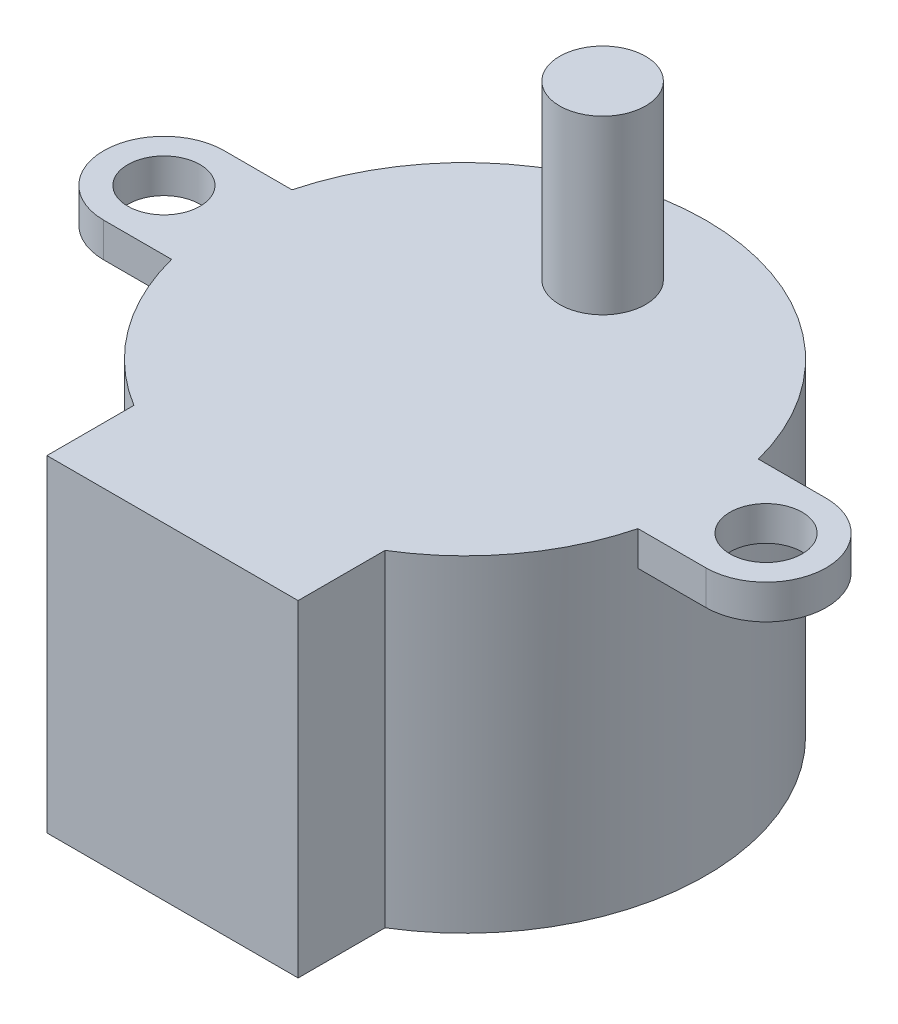
ISO-10303-21;
HEADER;
FILE_DESCRIPTION(('STEP AP214'),'2;1');
FILE_NAME('part.step','',(''),(''),'','','');
FILE_SCHEMA(('AUTOMOTIVE_DESIGN { 1 0 10303 214 1 1 1 1 }'));
ENDSEC;
DATA;
#1=APPLICATION_CONTEXT('core data for automotive mechanical design processes');
#2=APPLICATION_PROTOCOL_DEFINITION('international standard','automotive_design',2000,#1);
#3=PRODUCT_CONTEXT('',#1,'mechanical');
#4=PRODUCT('Part','Part','',(#3));
#5=PRODUCT_RELATED_PRODUCT_CATEGORY('part','',(#4));
#6=PRODUCT_DEFINITION_FORMATION('','',#4);
#7=PRODUCT_DEFINITION_CONTEXT('part definition',#1,'design');
#8=PRODUCT_DEFINITION('design','',#6,#7);
#9=PRODUCT_DEFINITION_SHAPE('','',#8);
#10=(LENGTH_UNIT() NAMED_UNIT(*) SI_UNIT(.MILLI.,.METRE.));
#11=(NAMED_UNIT(*) PLANE_ANGLE_UNIT() SI_UNIT($,.RADIAN.));
#12=(NAMED_UNIT(*) SI_UNIT($,.STERADIAN.) SOLID_ANGLE_UNIT());
#13=UNCERTAINTY_MEASURE_WITH_UNIT(LENGTH_MEASURE(1.E-05),#10,'distance_accuracy_value','');
#14=(GEOMETRIC_REPRESENTATION_CONTEXT(3) GLOBAL_UNCERTAINTY_ASSIGNED_CONTEXT((#13)) GLOBAL_UNIT_ASSIGNED_CONTEXT((#10,
#11,#12)) REPRESENTATION_CONTEXT('',''));
#15=CARTESIAN_POINT('',(0.,0.,0.));
#16=DIRECTION('',(0.,0.,1.));
#17=DIRECTION('',(1.,0.,0.));
#18=AXIS2_PLACEMENT_3D('',#15,#16,#17);
#19=CARTESIAN_POINT('',(0.,19.,0.));
#20=DIRECTION('',(0.,-1.,0.));
#21=DIRECTION('',(0.,0.,-1.));
#22=AXIS2_PLACEMENT_3D('',#19,#20,#21);
#23=CYLINDRICAL_SURFACE('',#22,14.);
#24=CARTESIAN_POINT('',(0.,17.,0.));
#25=DIRECTION('',(0.,-1.,0.));
#26=DIRECTION('',(0.,0.,-1.));
#27=AXIS2_PLACEMENT_3D('',#24,#25,#26);
#28=CIRCLE('',#27,14.);
#29=CARTESIAN_POINT('',(13.555441711726,17.,-3.5));
#30=VERTEX_POINT('',#29);
#31=CARTESIAN_POINT('',(13.555441711726,17.,3.5));
#32=VERTEX_POINT('',#31);
#33=EDGE_CURVE('E11',#30,#32,#28,.T.);
#34=ORIENTED_EDGE('',*,*,#33,.T.);
#35=DIRECTION('',(0.,-1.,0.));
#36=VECTOR('',#35,1.);
#37=CARTESIAN_POINT('',(13.555441711726,19.,3.5));
#38=LINE('',#37,#36);
#39=CARTESIAN_POINT('',(13.555441711726,19.,3.5));
#40=VERTEX_POINT('',#39);
#41=EDGE_CURVE('E158',#32,#40,#38,.F.);
#42=ORIENTED_EDGE('',*,*,#41,.T.);
#43=CARTESIAN_POINT('',(0.,19.,0.));
#44=DIRECTION('',(0.,1.,0.));
#45=DIRECTION('',(0.,0.,1.));
#46=AXIS2_PLACEMENT_3D('',#43,#44,#45);
#47=CIRCLE('',#46,14.);
#48=CARTESIAN_POINT('',(7.3,19.,11.9461290801665));
#49=VERTEX_POINT('',#48);
#50=EDGE_CURVE('E217',#49,#40,#47,.T.);
#51=ORIENTED_EDGE('',*,*,#50,.F.);
#52=DIRECTION('',(0.,-1.,0.));
#53=VECTOR('',#52,1.);
#54=CARTESIAN_POINT('',(7.3,19.,11.9461290801665));
#55=LINE('',#54,#53);
#56=CARTESIAN_POINT('',(7.3,0.,11.9461290801665));
#57=VERTEX_POINT('',#56);
#58=EDGE_CURVE('E208',#49,#57,#55,.T.);
#59=ORIENTED_EDGE('',*,*,#58,.T.);
#60=CARTESIAN_POINT('',(0.,0.,0.));
#61=DIRECTION('',(0.,1.,0.));
#62=DIRECTION('',(0.,0.,1.));
#63=AXIS2_PLACEMENT_3D('',#60,#61,#62);
#64=CIRCLE('',#63,14.);
#65=CARTESIAN_POINT('',(-7.3,0.,11.9461290801665));
#66=VERTEX_POINT('',#65);
#67=EDGE_CURVE('E216',#57,#66,#64,.T.);
#68=ORIENTED_EDGE('',*,*,#67,.T.);
#69=DIRECTION('',(0.,-1.,0.));
#70=VECTOR('',#69,1.);
#71=CARTESIAN_POINT('',(-7.3,19.,11.9461290801665));
#72=LINE('',#71,#70);
#73=CARTESIAN_POINT('',(-7.3,19.,11.9461290801665));
#74=VERTEX_POINT('',#73);
#75=EDGE_CURVE('E213',#66,#74,#72,.F.);
#76=ORIENTED_EDGE('',*,*,#75,.T.);
#77=CARTESIAN_POINT('',(-13.555441711726,19.,3.5));
#78=VERTEX_POINT('',#77);
#79=EDGE_CURVE('E221',#78,#74,#47,.T.);
#80=ORIENTED_EDGE('',*,*,#79,.F.);
#81=DIRECTION('',(0.,-1.,0.));
#82=VECTOR('',#81,1.);
#83=CARTESIAN_POINT('',(-13.555441711726,19.,3.5));
#84=LINE('',#83,#82);
#85=CARTESIAN_POINT('',(-13.555441711726,17.,3.5));
#86=VERTEX_POINT('',#85);
#87=EDGE_CURVE('E184',#78,#86,#84,.T.);
#88=ORIENTED_EDGE('',*,*,#87,.T.);
#89=CARTESIAN_POINT('',(0.,17.,0.));
#90=DIRECTION('',(0.,1.,0.));
#91=DIRECTION('',(0.,0.,1.));
#92=AXIS2_PLACEMENT_3D('',#89,#90,#91);
#93=CIRCLE('',#92,14.);
#94=CARTESIAN_POINT('',(-13.555441711726,17.,-3.5));
#95=VERTEX_POINT('',#94);
#96=EDGE_CURVE('E41',#95,#86,#93,.T.);
#97=ORIENTED_EDGE('',*,*,#96,.F.);
#98=DIRECTION('',(0.,-1.,0.));
#99=VECTOR('',#98,1.);
#100=CARTESIAN_POINT('',(-13.555441711726,19.,-3.5));
#101=LINE('',#100,#99);
#102=CARTESIAN_POINT('',(-13.555441711726,19.,-3.5));
#103=VERTEX_POINT('',#102);
#104=EDGE_CURVE('E188',#95,#103,#101,.F.);
#105=ORIENTED_EDGE('',*,*,#104,.T.);
#106=CARTESIAN_POINT('',(13.555441711726,19.,-3.5));
#107=VERTEX_POINT('',#106);
#108=EDGE_CURVE('E220',#107,#103,#47,.T.);
#109=ORIENTED_EDGE('',*,*,#108,.F.);
#110=DIRECTION('',(0.,-1.,0.));
#111=VECTOR('',#110,1.);
#112=CARTESIAN_POINT('',(13.555441711726,19.,-3.5));
#113=LINE('',#112,#111);
#114=EDGE_CURVE('E155',#107,#30,#113,.T.);
#115=ORIENTED_EDGE('',*,*,#114,.T.);
#116=EDGE_LOOP('',(#34,#42,#51,#59,#68,#76,#80,#88,#97,#105,#109,#115));
#117=FACE_BOUND('',#116,.T.);
#118=ADVANCED_FACE('F34',(#117),#23,.T.);
#119=CARTESIAN_POINT('',(0.,19.,0.));
#120=DIRECTION('',(0.,1.,0.));
#121=DIRECTION('',(0.,0.,1.));
#122=AXIS2_PLACEMENT_3D('',#119,#120,#121);
#123=PLANE('',#122);
#124=CARTESIAN_POINT('',(0.,19.,-8.));
#125=DIRECTION('',(0.,1.,0.));
#126=DIRECTION('',(0.,0.,1.));
#127=AXIS2_PLACEMENT_3D('',#124,#125,#126);
#128=CIRCLE('',#127,2.5);
#129=CARTESIAN_POINT('',(0.,19.,-5.5));
#130=VERTEX_POINT('',#129);
#131=EDGE_CURVE('E394',#130,#130,#128,.T.);
#132=ORIENTED_EDGE('',*,*,#131,.F.);
#133=EDGE_LOOP('',(#132));
#134=FACE_BOUND('',#133,.T.);
#135=ORIENTED_EDGE('',*,*,#50,.T.);
#136=DIRECTION('',(1.,0.,0.));
#137=VECTOR('',#136,1.);
#138=CARTESIAN_POINT('',(12.3998637377611,19.,3.5));
#139=LINE('',#138,#137);
#140=CARTESIAN_POINT('',(17.5,19.,3.5));
#141=VERTEX_POINT('',#140);
#142=EDGE_CURVE('E143',#40,#141,#139,.T.);
#143=ORIENTED_EDGE('',*,*,#142,.T.);
#144=CARTESIAN_POINT('',(17.5,19.,0.));
#145=DIRECTION('',(0.,1.,0.));
#146=DIRECTION('',(0.,0.,-1.));
#147=AXIS2_PLACEMENT_3D('',#144,#145,#146);
#148=CIRCLE('',#147,3.5);
#149=CARTESIAN_POINT('',(17.5,19.,-3.5));
#150=VERTEX_POINT('',#149);
#151=EDGE_CURVE('E151',#141,#150,#148,.T.);
#152=ORIENTED_EDGE('',*,*,#151,.T.);
#153=DIRECTION('',(-1.,0.,0.));
#154=VECTOR('',#153,1.);
#155=CARTESIAN_POINT('',(17.5,19.,-3.5));
#156=LINE('',#155,#154);
#157=EDGE_CURVE('E48',#150,#107,#156,.T.);
#158=ORIENTED_EDGE('',*,*,#157,.T.);
#159=ORIENTED_EDGE('',*,*,#108,.T.);
#160=DIRECTION('',(-1.,0.,0.));
#161=VECTOR('',#160,1.);
#162=CARTESIAN_POINT('',(-17.5,19.,-3.5));
#163=LINE('',#162,#161);
#164=CARTESIAN_POINT('',(-17.5,19.,-3.5));
#165=VERTEX_POINT('',#164);
#166=EDGE_CURVE('E172',#103,#165,#163,.T.);
#167=ORIENTED_EDGE('',*,*,#166,.T.);
#168=CARTESIAN_POINT('',(-17.5,19.,0.));
#169=DIRECTION('',(0.,1.,0.));
#170=DIRECTION('',(0.,0.,1.));
#171=AXIS2_PLACEMENT_3D('',#168,#169,#170);
#172=CIRCLE('',#171,3.5);
#173=CARTESIAN_POINT('',(-17.5,19.,3.5));
#174=VERTEX_POINT('',#173);
#175=EDGE_CURVE('E165',#165,#174,#172,.T.);
#176=ORIENTED_EDGE('',*,*,#175,.T.);
#177=DIRECTION('',(1.,0.,0.));
#178=VECTOR('',#177,1.);
#179=CARTESIAN_POINT('',(-12.3998637377611,19.,3.5));
#180=LINE('',#179,#178);
#181=EDGE_CURVE('E55',#174,#78,#180,.T.);
#182=ORIENTED_EDGE('',*,*,#181,.T.);
#183=ORIENTED_EDGE('',*,*,#79,.T.);
#184=DIRECTION('',(0.,0.,1.));
#185=VECTOR('',#184,1.);
#186=CARTESIAN_POINT('',(-7.3,19.,17.));
#187=LINE('',#186,#185);
#188=CARTESIAN_POINT('',(-7.3,19.,17.));
#189=VERTEX_POINT('',#188);
#190=EDGE_CURVE('E191',#74,#189,#187,.T.);
#191=ORIENTED_EDGE('',*,*,#190,.T.);
#192=DIRECTION('',(1.,0.,0.));
#193=VECTOR('',#192,1.);
#194=CARTESIAN_POINT('',(-7.3,19.,17.));
#195=LINE('',#194,#193);
#196=CARTESIAN_POINT('',(7.3,19.,17.));
#197=VERTEX_POINT('',#196);
#198=EDGE_CURVE('E202',#189,#197,#195,.T.);
#199=ORIENTED_EDGE('',*,*,#198,.T.);
#200=DIRECTION('',(0.,0.,-1.));
#201=VECTOR('',#200,1.);
#202=CARTESIAN_POINT('',(7.3,19.,11.5041768420127));
#203=LINE('',#202,#201);
#204=EDGE_CURVE('E195',#197,#49,#203,.T.);
#205=ORIENTED_EDGE('',*,*,#204,.T.);
#206=EDGE_LOOP('',(#135,#143,#152,#158,#159,#167,#176,#182,#183,#191,#199,#205));
#207=FACE_BOUND('',#206,.T.);
#208=CARTESIAN_POINT('',(-17.5,19.,0.));
#209=DIRECTION('',(0.,1.,0.));
#210=DIRECTION('',(0.,0.,1.));
#211=AXIS2_PLACEMENT_3D('',#208,#209,#210);
#212=CIRCLE('',#211,2.1);
#213=CARTESIAN_POINT('',(-17.5,19.,2.1));
#214=VERTEX_POINT('',#213);
#215=EDGE_CURVE('E161',#214,#214,#212,.T.);
#216=ORIENTED_EDGE('',*,*,#215,.F.);
#217=EDGE_LOOP('',(#216));
#218=FACE_BOUND('',#217,.T.);
#219=CARTESIAN_POINT('',(17.5,19.,0.));
#220=DIRECTION('',(0.,1.,0.));
#221=DIRECTION('',(0.,0.,-1.));
#222=AXIS2_PLACEMENT_3D('',#219,#220,#221);
#223=CIRCLE('',#222,2.1);
#224=CARTESIAN_POINT('',(17.5,19.,-2.1));
#225=VERTEX_POINT('',#224);
#226=EDGE_CURVE('E147',#225,#225,#223,.T.);
#227=ORIENTED_EDGE('',*,*,#226,.F.);
#228=EDGE_LOOP('',(#227));
#229=FACE_BOUND('',#228,.T.);
#230=ADVANCED_FACE('F236',(#134,#207,#218,#229),#123,.T.);
#231=CARTESIAN_POINT('',(0.,0.,0.));
#232=DIRECTION('',(0.,1.,0.));
#233=DIRECTION('',(0.,0.,1.));
#234=AXIS2_PLACEMENT_3D('',#231,#232,#233);
#235=PLANE('',#234);
#236=ORIENTED_EDGE('',*,*,#67,.F.);
#237=DIRECTION('',(0.,0.,-1.));
#238=VECTOR('',#237,1.);
#239=CARTESIAN_POINT('',(7.3,0.,11.5041768420127));
#240=LINE('',#239,#238);
#241=CARTESIAN_POINT('',(7.3,0.,17.));
#242=VERTEX_POINT('',#241);
#243=EDGE_CURVE('E198',#242,#57,#240,.T.);
#244=ORIENTED_EDGE('',*,*,#243,.F.);
#245=DIRECTION('',(1.,0.,0.));
#246=VECTOR('',#245,1.);
#247=CARTESIAN_POINT('',(-7.3,0.,17.));
#248=LINE('',#247,#246);
#249=CARTESIAN_POINT('',(-7.3,0.,17.));
#250=VERTEX_POINT('',#249);
#251=EDGE_CURVE('E194',#250,#242,#248,.T.);
#252=ORIENTED_EDGE('',*,*,#251,.F.);
#253=DIRECTION('',(0.,0.,1.));
#254=VECTOR('',#253,1.);
#255=CARTESIAN_POINT('',(-7.3,0.,17.));
#256=LINE('',#255,#254);
#257=EDGE_CURVE('E192',#66,#250,#256,.T.);
#258=ORIENTED_EDGE('',*,*,#257,.F.);
#259=EDGE_LOOP('',(#236,#244,#252,#258));
#260=FACE_BOUND('',#259,.T.);
#261=ADVANCED_FACE('F259',(#260),#235,.F.);
#262=CARTESIAN_POINT('',(-7.3,0.,17.));
#263=DIRECTION('',(-1.,0.,0.));
#264=DIRECTION('',(0.,0.,1.));
#265=AXIS2_PLACEMENT_3D('',#262,#263,#264);
#266=PLANE('',#265);
#267=ORIENTED_EDGE('',*,*,#75,.F.);
#268=ORIENTED_EDGE('',*,*,#257,.T.);
#269=DIRECTION('',(0.,1.,0.));
#270=VECTOR('',#269,1.);
#271=CARTESIAN_POINT('',(-7.3,0.,17.));
#272=LINE('',#271,#270);
#273=EDGE_CURVE('E200',#250,#189,#272,.T.);
#274=ORIENTED_EDGE('',*,*,#273,.T.);
#275=ORIENTED_EDGE('',*,*,#190,.F.);
#276=EDGE_LOOP('',(#267,#268,#274,#275));
#277=FACE_BOUND('',#276,.T.);
#278=ADVANCED_FACE('F265',(#277),#266,.T.);
#279=CARTESIAN_POINT('',(7.3,0.,11.5041768420127));
#280=DIRECTION('',(1.,0.,0.));
#281=DIRECTION('',(0.,0.,-1.));
#282=AXIS2_PLACEMENT_3D('',#279,#280,#281);
#283=PLANE('',#282);
#284=ORIENTED_EDGE('',*,*,#58,.F.);
#285=ORIENTED_EDGE('',*,*,#204,.F.);
#286=DIRECTION('',(0.,1.,0.));
#287=VECTOR('',#286,1.);
#288=CARTESIAN_POINT('',(7.3,0.,17.));
#289=LINE('',#288,#287);
#290=EDGE_CURVE('E206',#242,#197,#289,.T.);
#291=ORIENTED_EDGE('',*,*,#290,.F.);
#292=ORIENTED_EDGE('',*,*,#243,.T.);
#293=EDGE_LOOP('',(#284,#285,#291,#292));
#294=FACE_BOUND('',#293,.T.);
#295=ADVANCED_FACE('F271',(#294),#283,.T.);
#296=CARTESIAN_POINT('',(-7.3,0.,17.));
#297=DIRECTION('',(0.,0.,1.));
#298=DIRECTION('',(1.,0.,0.));
#299=AXIS2_PLACEMENT_3D('',#296,#297,#298);
#300=PLANE('',#299);
#301=ORIENTED_EDGE('',*,*,#198,.F.);
#302=ORIENTED_EDGE('',*,*,#273,.F.);
#303=ORIENTED_EDGE('',*,*,#251,.T.);
#304=ORIENTED_EDGE('',*,*,#290,.T.);
#305=EDGE_LOOP('',(#301,#302,#303,#304));
#306=FACE_BOUND('',#305,.T.);
#307=ADVANCED_FACE('F273',(#306),#300,.T.);
#308=CARTESIAN_POINT('',(-17.5,17.,-3.5));
#309=DIRECTION('',(0.,0.,-1.));
#310=DIRECTION('',(-1.,0.,0.));
#311=AXIS2_PLACEMENT_3D('',#308,#309,#310);
#312=PLANE('',#311);
#313=ORIENTED_EDGE('',*,*,#104,.F.);
#314=DIRECTION('',(-1.,0.,0.));
#315=VECTOR('',#314,1.);
#316=CARTESIAN_POINT('',(-17.5,17.,-3.5));
#317=LINE('',#316,#315);
#318=CARTESIAN_POINT('',(-17.5,17.,-3.5));
#319=VERTEX_POINT('',#318);
#320=EDGE_CURVE('E175',#95,#319,#317,.T.);
#321=ORIENTED_EDGE('',*,*,#320,.T.);
#322=DIRECTION('',(0.,1.,0.));
#323=VECTOR('',#322,1.);
#324=CARTESIAN_POINT('',(-17.5,17.,-3.5));
#325=LINE('',#324,#323);
#326=EDGE_CURVE('E181',#319,#165,#325,.T.);
#327=ORIENTED_EDGE('',*,*,#326,.T.);
#328=ORIENTED_EDGE('',*,*,#166,.F.);
#329=EDGE_LOOP('',(#313,#321,#327,#328));
#330=FACE_BOUND('',#329,.T.);
#331=ADVANCED_FACE('F239',(#330),#312,.T.);
#332=CARTESIAN_POINT('',(-12.3998637377611,17.,3.5));
#333=DIRECTION('',(0.,0.,1.));
#334=DIRECTION('',(1.,0.,0.));
#335=AXIS2_PLACEMENT_3D('',#332,#333,#334);
#336=PLANE('',#335);
#337=ORIENTED_EDGE('',*,*,#87,.F.);
#338=ORIENTED_EDGE('',*,*,#181,.F.);
#339=DIRECTION('',(0.,1.,0.));
#340=VECTOR('',#339,1.);
#341=CARTESIAN_POINT('',(-17.5,17.,3.5));
#342=LINE('',#341,#340);
#343=CARTESIAN_POINT('',(-17.5,17.,3.5));
#344=VERTEX_POINT('',#343);
#345=EDGE_CURVE('E177',#344,#174,#342,.T.);
#346=ORIENTED_EDGE('',*,*,#345,.F.);
#347=DIRECTION('',(1.,0.,0.));
#348=VECTOR('',#347,1.);
#349=CARTESIAN_POINT('',(-12.3998637377611,17.,3.5));
#350=LINE('',#349,#348);
#351=EDGE_CURVE('E171',#344,#86,#350,.T.);
#352=ORIENTED_EDGE('',*,*,#351,.T.);
#353=EDGE_LOOP('',(#337,#338,#346,#352));
#354=FACE_BOUND('',#353,.T.);
#355=ADVANCED_FACE('F231',(#354),#336,.T.);
#356=CARTESIAN_POINT('',(-17.5,17.,0.));
#357=DIRECTION('',(0.,1.,0.));
#358=DIRECTION('',(0.,0.,1.));
#359=AXIS2_PLACEMENT_3D('',#356,#357,#358);
#360=CYLINDRICAL_SURFACE('',#359,3.5);
#361=ORIENTED_EDGE('',*,*,#175,.F.);
#362=ORIENTED_EDGE('',*,*,#326,.F.);
#363=CARTESIAN_POINT('',(-17.5,17.,0.));
#364=DIRECTION('',(0.,1.,0.));
#365=DIRECTION('',(0.,0.,1.));
#366=AXIS2_PLACEMENT_3D('',#363,#364,#365);
#367=CIRCLE('',#366,3.5);
#368=EDGE_CURVE('E168',#319,#344,#367,.T.);
#369=ORIENTED_EDGE('',*,*,#368,.T.);
#370=ORIENTED_EDGE('',*,*,#345,.T.);
#371=EDGE_LOOP('',(#361,#362,#369,#370));
#372=FACE_BOUND('',#371,.T.);
#373=ADVANCED_FACE('F243',(#372),#360,.T.);
#374=CARTESIAN_POINT('',(-17.5,17.,0.));
#375=DIRECTION('',(0.,1.,0.));
#376=DIRECTION('',(0.,0.,1.));
#377=AXIS2_PLACEMENT_3D('',#374,#375,#376);
#378=PLANE('',#377);
#379=CARTESIAN_POINT('',(-17.5,17.,0.));
#380=DIRECTION('',(0.,1.,0.));
#381=DIRECTION('',(0.,0.,1.));
#382=AXIS2_PLACEMENT_3D('',#379,#380,#381);
#383=CIRCLE('',#382,2.1);
#384=CARTESIAN_POINT('',(-17.5,17.,2.1));
#385=VERTEX_POINT('',#384);
#386=EDGE_CURVE('E162',#385,#385,#383,.T.);
#387=ORIENTED_EDGE('',*,*,#386,.T.);
#388=EDGE_LOOP('',(#387));
#389=FACE_BOUND('',#388,.T.);
#390=ORIENTED_EDGE('',*,*,#320,.F.);
#391=ORIENTED_EDGE('',*,*,#96,.T.);
#392=ORIENTED_EDGE('',*,*,#351,.F.);
#393=ORIENTED_EDGE('',*,*,#368,.F.);
#394=EDGE_LOOP('',(#390,#391,#392,#393));
#395=FACE_BOUND('',#394,.T.);
#396=ADVANCED_FACE('F227',(#389,#395),#378,.F.);
#397=CARTESIAN_POINT('',(-17.5,17.,0.));
#398=DIRECTION('',(0.,1.,0.));
#399=DIRECTION('',(0.,0.,1.));
#400=AXIS2_PLACEMENT_3D('',#397,#398,#399);
#401=CYLINDRICAL_SURFACE('',#400,2.1);
#402=ORIENTED_EDGE('',*,*,#386,.F.);
#403=EDGE_LOOP('',(#402));
#404=FACE_BOUND('',#403,.T.);
#405=ORIENTED_EDGE('',*,*,#215,.T.);
#406=EDGE_LOOP('',(#405));
#407=FACE_BOUND('',#406,.T.);
#408=ADVANCED_FACE('F250',(#404,#407),#401,.F.);
#409=CARTESIAN_POINT('',(12.3998637377611,17.,3.5));
#410=DIRECTION('',(0.,0.,1.));
#411=DIRECTION('',(1.,0.,0.));
#412=AXIS2_PLACEMENT_3D('',#409,#410,#411);
#413=PLANE('',#412);
#414=ORIENTED_EDGE('',*,*,#41,.F.);
#415=DIRECTION('',(1.,0.,0.));
#416=VECTOR('',#415,1.);
#417=CARTESIAN_POINT('',(12.3998637377611,17.,3.5));
#418=LINE('',#417,#416);
#419=CARTESIAN_POINT('',(17.5,17.,3.5));
#420=VERTEX_POINT('',#419);
#421=EDGE_CURVE('E131',#32,#420,#418,.T.);
#422=ORIENTED_EDGE('',*,*,#421,.T.);
#423=DIRECTION('',(0.,1.,0.));
#424=VECTOR('',#423,1.);
#425=CARTESIAN_POINT('',(17.5,17.,3.5));
#426=LINE('',#425,#424);
#427=EDGE_CURVE('E130',#420,#141,#426,.T.);
#428=ORIENTED_EDGE('',*,*,#427,.T.);
#429=ORIENTED_EDGE('',*,*,#142,.F.);
#430=EDGE_LOOP('',(#414,#422,#428,#429));
#431=FACE_BOUND('',#430,.T.);
#432=ADVANCED_FACE('F290',(#431),#413,.T.);
#433=CARTESIAN_POINT('',(17.5,17.,-3.5));
#434=DIRECTION('',(0.,0.,-1.));
#435=DIRECTION('',(-1.,0.,0.));
#436=AXIS2_PLACEMENT_3D('',#433,#434,#435);
#437=PLANE('',#436);
#438=ORIENTED_EDGE('',*,*,#114,.F.);
#439=ORIENTED_EDGE('',*,*,#157,.F.);
#440=DIRECTION('',(0.,1.,0.));
#441=VECTOR('',#440,1.);
#442=CARTESIAN_POINT('',(17.5,17.,-3.5));
#443=LINE('',#442,#441);
#444=CARTESIAN_POINT('',(17.5,17.,-3.5));
#445=VERTEX_POINT('',#444);
#446=EDGE_CURVE('E122',#445,#150,#443,.T.);
#447=ORIENTED_EDGE('',*,*,#446,.F.);
#448=DIRECTION('',(-1.,0.,0.));
#449=VECTOR('',#448,1.);
#450=CARTESIAN_POINT('',(17.5,17.,-3.5));
#451=LINE('',#450,#449);
#452=EDGE_CURVE('E125',#445,#30,#451,.T.);
#453=ORIENTED_EDGE('',*,*,#452,.T.);
#454=EDGE_LOOP('',(#438,#439,#447,#453));
#455=FACE_BOUND('',#454,.T.);
#456=ADVANCED_FACE('F124',(#455),#437,.T.);
#457=CARTESIAN_POINT('',(17.5,17.,0.));
#458=DIRECTION('',(0.,1.,0.));
#459=DIRECTION('',(0.,0.,1.));
#460=AXIS2_PLACEMENT_3D('',#457,#458,#459);
#461=CYLINDRICAL_SURFACE('',#460,3.5);
#462=ORIENTED_EDGE('',*,*,#151,.F.);
#463=ORIENTED_EDGE('',*,*,#427,.F.);
#464=CARTESIAN_POINT('',(17.5,17.,0.));
#465=DIRECTION('',(0.,1.,0.));
#466=DIRECTION('',(0.,0.,-1.));
#467=AXIS2_PLACEMENT_3D('',#464,#465,#466);
#468=CIRCLE('',#467,3.5);
#469=EDGE_CURVE('E138',#420,#445,#468,.T.);
#470=ORIENTED_EDGE('',*,*,#469,.T.);
#471=ORIENTED_EDGE('',*,*,#446,.T.);
#472=EDGE_LOOP('',(#462,#463,#470,#471));
#473=FACE_BOUND('',#472,.T.);
#474=ADVANCED_FACE('F141',(#473),#461,.T.);
#475=CARTESIAN_POINT('',(17.5,17.,0.));
#476=DIRECTION('',(0.,-1.,0.));
#477=DIRECTION('',(0.,0.,-1.));
#478=AXIS2_PLACEMENT_3D('',#475,#476,#477);
#479=PLANE('',#478);
#480=ORIENTED_EDGE('',*,*,#33,.F.);
#481=ORIENTED_EDGE('',*,*,#452,.F.);
#482=ORIENTED_EDGE('',*,*,#469,.F.);
#483=ORIENTED_EDGE('',*,*,#421,.F.);
#484=EDGE_LOOP('',(#480,#481,#482,#483));
#485=FACE_BOUND('',#484,.T.);
#486=CARTESIAN_POINT('',(17.5,17.,0.));
#487=DIRECTION('',(0.,1.,0.));
#488=DIRECTION('',(0.,0.,-1.));
#489=AXIS2_PLACEMENT_3D('',#486,#487,#488);
#490=CIRCLE('',#489,2.1);
#491=CARTESIAN_POINT('',(17.5,17.,-2.1));
#492=VERTEX_POINT('',#491);
#493=EDGE_CURVE('E153',#492,#492,#490,.T.);
#494=ORIENTED_EDGE('',*,*,#493,.T.);
#495=EDGE_LOOP('',(#494));
#496=FACE_BOUND('',#495,.T.);
#497=ADVANCED_FACE('F135',(#485,#496),#479,.T.);
#498=CARTESIAN_POINT('',(17.5,17.,0.));
#499=DIRECTION('',(0.,1.,0.));
#500=DIRECTION('',(0.,0.,1.));
#501=AXIS2_PLACEMENT_3D('',#498,#499,#500);
#502=CYLINDRICAL_SURFACE('',#501,2.1);
#503=ORIENTED_EDGE('',*,*,#493,.F.);
#504=EDGE_LOOP('',(#503));
#505=FACE_BOUND('',#504,.T.);
#506=ORIENTED_EDGE('',*,*,#226,.T.);
#507=EDGE_LOOP('',(#506));
#508=FACE_BOUND('',#507,.T.);
#509=ADVANCED_FACE('F355',(#505,#508),#502,.F.);
#510=CARTESIAN_POINT('',(0.,29.,-8.));
#511=DIRECTION('',(0.,-1.,0.));
#512=DIRECTION('',(0.,0.,-1.));
#513=AXIS2_PLACEMENT_3D('',#510,#511,#512);
#514=CYLINDRICAL_SURFACE('',#513,2.5);
#515=CARTESIAN_POINT('',(0.,29.,-8.));
#516=DIRECTION('',(0.,1.,0.));
#517=DIRECTION('',(0.,0.,1.));
#518=AXIS2_PLACEMENT_3D('',#515,#516,#517);
#519=CIRCLE('',#518,2.5);
#520=CARTESIAN_POINT('',(0.,29.,-5.5));
#521=VERTEX_POINT('',#520);
#522=EDGE_CURVE('E393',#521,#521,#519,.T.);
#523=ORIENTED_EDGE('',*,*,#522,.F.);
#524=EDGE_LOOP('',(#523));
#525=FACE_BOUND('',#524,.T.);
#526=ORIENTED_EDGE('',*,*,#131,.T.);
#527=EDGE_LOOP('',(#526));
#528=FACE_BOUND('',#527,.T.);
#529=ADVANCED_FACE('F362',(#525,#528),#514,.T.);
#530=CARTESIAN_POINT('',(0.,29.,-8.));
#531=DIRECTION('',(0.,1.,0.));
#532=DIRECTION('',(0.,0.,1.));
#533=AXIS2_PLACEMENT_3D('',#530,#531,#532);
#534=PLANE('',#533);
#535=ORIENTED_EDGE('',*,*,#522,.T.);
#536=EDGE_LOOP('',(#535));
#537=FACE_BOUND('',#536,.T.);
#538=ADVANCED_FACE('F377',(#537),#534,.T.);
#539=CLOSED_SHELL('',(#118,#230,#261,#278,#295,#307,#331,#355,#373,#396,#408,#432,#456,#474,
#497,#509,#529,#538));
#540=MANIFOLD_SOLID_BREP('B2',#539);
#541=ADVANCED_BREP_SHAPE_REPRESENTATION('',(#18,#540),#14);
#542=SHAPE_DEFINITION_REPRESENTATION(#9,#541);
ENDSEC;
END-ISO-10303-21;
